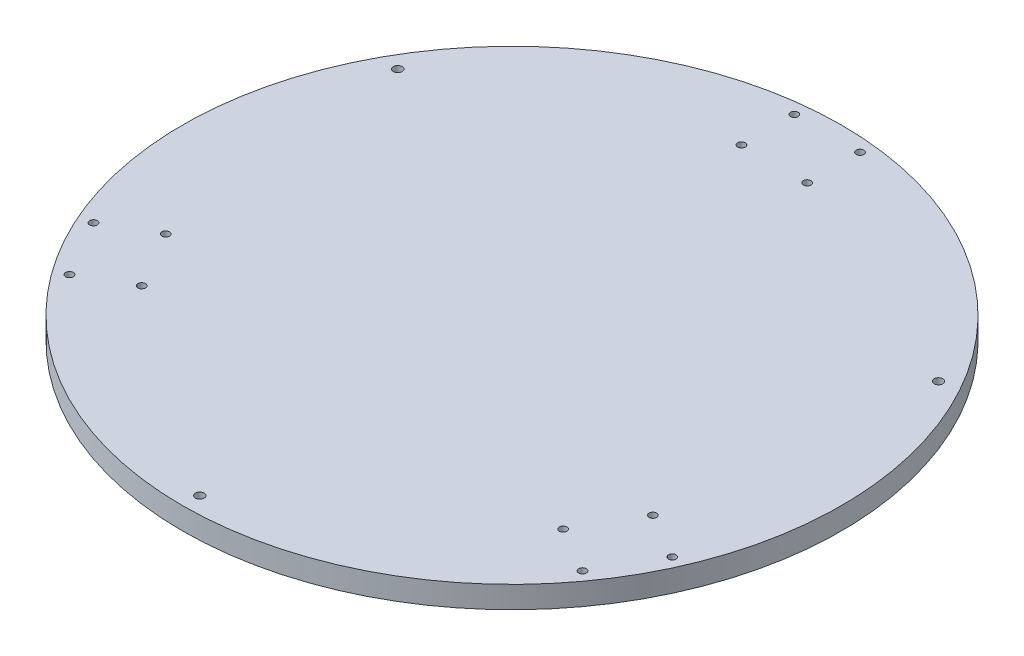
ISO-10303-21;
HEADER;
FILE_DESCRIPTION(('STEP AP214'),'2;1');
FILE_NAME('part.step','',(''),(''),'','','');
FILE_SCHEMA(('AUTOMOTIVE_DESIGN { 1 0 10303 214 1 1 1 1 }'));
ENDSEC;
DATA;
#1=APPLICATION_CONTEXT('core data for automotive mechanical design processes');
#2=APPLICATION_PROTOCOL_DEFINITION('international standard','automotive_design',2000,#1);
#3=PRODUCT_CONTEXT('',#1,'mechanical');
#4=PRODUCT('Part','Part','',(#3));
#5=PRODUCT_RELATED_PRODUCT_CATEGORY('part','',(#4));
#6=PRODUCT_DEFINITION_FORMATION('','',#4);
#7=PRODUCT_DEFINITION_CONTEXT('part definition',#1,'design');
#8=PRODUCT_DEFINITION('design','',#6,#7);
#9=PRODUCT_DEFINITION_SHAPE('','',#8);
#10=(LENGTH_UNIT() NAMED_UNIT(*) SI_UNIT(.MILLI.,.METRE.));
#11=(NAMED_UNIT(*) PLANE_ANGLE_UNIT() SI_UNIT($,.RADIAN.));
#12=(NAMED_UNIT(*) SI_UNIT($,.STERADIAN.) SOLID_ANGLE_UNIT());
#13=UNCERTAINTY_MEASURE_WITH_UNIT(LENGTH_MEASURE(1.E-05),#10,'distance_accuracy_value','');
#14=(GEOMETRIC_REPRESENTATION_CONTEXT(3) GLOBAL_UNCERTAINTY_ASSIGNED_CONTEXT((#13)) GLOBAL_UNIT_ASSIGNED_CONTEXT((#10,
#11,#12)) REPRESENTATION_CONTEXT('',''));
#15=CARTESIAN_POINT('',(0.,0.,0.));
#16=DIRECTION('',(0.,0.,1.));
#17=DIRECTION('',(1.,0.,0.));
#18=AXIS2_PLACEMENT_3D('',#15,#16,#17);
#19=CARTESIAN_POINT('',(0.,10.,0.));
#20=DIRECTION('',(0.,-1.,0.));
#21=DIRECTION('',(0.,0.,-1.));
#22=AXIS2_PLACEMENT_3D('',#19,#20,#21);
#23=CYLINDRICAL_SURFACE('',#22,150.);
#24=CARTESIAN_POINT('',(0.,10.,0.));
#25=DIRECTION('',(0.,1.,0.));
#26=DIRECTION('',(0.,0.,1.));
#27=AXIS2_PLACEMENT_3D('',#24,#25,#26);
#28=CIRCLE('',#27,150.);
#29=CARTESIAN_POINT('',(0.,10.,150.));
#30=VERTEX_POINT('',#29);
#31=EDGE_CURVE('E10',#30,#30,#28,.T.);
#32=ORIENTED_EDGE('',*,*,#31,.F.);
#33=EDGE_LOOP('',(#32));
#34=FACE_BOUND('',#33,.T.);
#35=CARTESIAN_POINT('',(0.,0.,0.));
#36=DIRECTION('',(0.,1.,0.));
#37=DIRECTION('',(0.,0.,1.));
#38=AXIS2_PLACEMENT_3D('',#35,#36,#37);
#39=CIRCLE('',#38,150.);
#40=CARTESIAN_POINT('',(0.,0.,150.));
#41=VERTEX_POINT('',#40);
#42=EDGE_CURVE('E46',#41,#41,#39,.T.);
#43=ORIENTED_EDGE('',*,*,#42,.T.);
#44=EDGE_LOOP('',(#43));
#45=FACE_BOUND('',#44,.T.);
#46=ADVANCED_FACE('F43',(#34,#45),#23,.T.);
#47=CARTESIAN_POINT('',(0.,10.,0.));
#48=DIRECTION('',(0.,1.,0.));
#49=DIRECTION('',(0.,0.,1.));
#50=AXIS2_PLACEMENT_3D('',#47,#48,#49);
#51=PLANE('',#50);
#52=CARTESIAN_POINT('',(-123.062136007708,10.,-71.0499573511008));
#53=DIRECTION('',(0.,1.,0.));
#54=DIRECTION('',(0.,0.,1.));
#55=AXIS2_PLACEMENT_3D('',#52,#53,#54);
#56=CIRCLE('',#55,2.);
#57=CARTESIAN_POINT('',(-123.062136007708,10.,-69.0499573511008));
#58=VERTEX_POINT('',#57);
#59=EDGE_CURVE('E118',#58,#58,#56,.T.);
#60=ORIENTED_EDGE('',*,*,#59,.F.);
#61=EDGE_LOOP('',(#60));
#62=FACE_BOUND('',#61,.T.);
#63=CARTESIAN_POINT('',(14.9450000000001,10.,-119.39269785433));
#64=DIRECTION('',(0.,1.,0.));
#65=DIRECTION('',(0.,0.,-1.));
#66=AXIS2_PLACEMENT_3D('',#63,#64,#65);
#67=CIRCLE('',#66,1.73);
#68=CARTESIAN_POINT('',(14.9450000000001,10.,-121.12269785433));
#69=VERTEX_POINT('',#68);
#70=EDGE_CURVE('E104',#69,#69,#67,.T.);
#71=ORIENTED_EDGE('',*,*,#70,.F.);
#72=EDGE_LOOP('',(#71));
#73=FACE_BOUND('',#72,.T.);
#74=CARTESIAN_POINT('',(14.9450000000002,10.,-143.45269785433));
#75=DIRECTION('',(0.,1.,0.));
#76=DIRECTION('',(0.,0.,-1.));
#77=AXIS2_PLACEMENT_3D('',#74,#75,#76);
#78=CIRCLE('',#77,1.73);
#79=CARTESIAN_POINT('',(14.9450000000002,10.,-145.18269785433));
#80=VERTEX_POINT('',#79);
#81=EDGE_CURVE('E103',#80,#80,#78,.T.);
#82=ORIENTED_EDGE('',*,*,#81,.F.);
#83=EDGE_LOOP('',(#82));
#84=FACE_BOUND('',#83,.T.);
#85=CARTESIAN_POINT('',(-14.945,10.,-119.39269785433));
#86=DIRECTION('',(0.,1.,0.));
#87=DIRECTION('',(0.,0.,1.));
#88=AXIS2_PLACEMENT_3D('',#85,#86,#87);
#89=CIRCLE('',#88,1.73);
#90=CARTESIAN_POINT('',(-14.945,10.,-117.66269785433));
#91=VERTEX_POINT('',#90);
#92=EDGE_CURVE('E61',#91,#91,#89,.T.);
#93=ORIENTED_EDGE('',*,*,#92,.F.);
#94=EDGE_LOOP('',(#93));
#95=FACE_BOUND('',#94,.T.);
#96=CARTESIAN_POINT('',(131.706180583272,10.,58.7835992676033));
#97=DIRECTION('',(0.,1.,0.));
#98=DIRECTION('',(0.,0.,1.));
#99=AXIS2_PLACEMENT_3D('',#96,#97,#98);
#100=CIRCLE('',#99,1.7300000000058);
#101=CARTESIAN_POINT('',(131.706180583272,10.,60.5135992676091));
#102=VERTEX_POINT('',#101);
#103=EDGE_CURVE('E94',#102,#102,#100,.T.);
#104=ORIENTED_EDGE('',*,*,#103,.F.);
#105=EDGE_LOOP('',(#104));
#106=FACE_BOUND('',#105,.T.);
#107=CARTESIAN_POINT('',(110.869609368218,10.,46.7535992676033));
#108=DIRECTION('',(0.,1.,0.));
#109=DIRECTION('',(0.,0.,1.));
#110=AXIS2_PLACEMENT_3D('',#107,#108,#109);
#111=CIRCLE('',#110,1.73000000000569);
#112=CARTESIAN_POINT('',(110.869609368218,10.,48.483599267609));
#113=VERTEX_POINT('',#112);
#114=EDGE_CURVE('E86',#113,#113,#111,.T.);
#115=ORIENTED_EDGE('',*,*,#114,.F.);
#116=EDGE_LOOP('',(#115));
#117=FACE_BOUND('',#116,.T.);
#118=CARTESIAN_POINT('',(116.761180583272,10.,84.6690985867202));
#119=DIRECTION('',(0.,1.,0.));
#120=DIRECTION('',(0.,0.,-1.));
#121=AXIS2_PLACEMENT_3D('',#118,#119,#120);
#122=CIRCLE('',#121,1.72999999999094);
#123=CARTESIAN_POINT('',(116.761180583272,10.,82.9390985867292));
#124=VERTEX_POINT('',#123);
#125=EDGE_CURVE('E78',#124,#124,#122,.T.);
#126=ORIENTED_EDGE('',*,*,#125,.F.);
#127=EDGE_LOOP('',(#126));
#128=FACE_BOUND('',#127,.T.);
#129=CARTESIAN_POINT('',(95.924609368218,10.,72.6390985867202));
#130=DIRECTION('',(0.,1.,0.));
#131=DIRECTION('',(0.,0.,-1.));
#132=AXIS2_PLACEMENT_3D('',#129,#130,#131);
#133=CIRCLE('',#132,1.72999999999108);
#134=CARTESIAN_POINT('',(95.924609368218,10.,70.9090985867291));
#135=VERTEX_POINT('',#134);
#136=EDGE_CURVE('E69',#135,#135,#133,.T.);
#137=ORIENTED_EDGE('',*,*,#136,.F.);
#138=EDGE_LOOP('',(#137));
#139=FACE_BOUND('',#138,.T.);
#140=CARTESIAN_POINT('',(-116.761180583257,10.,84.6690985867289));
#141=DIRECTION('',(0.,1.,0.));
#142=DIRECTION('',(0.,0.,1.));
#143=AXIS2_PLACEMENT_3D('',#140,#141,#142);
#144=CIRCLE('',#143,1.73000000001008);
#145=CARTESIAN_POINT('',(-116.761180583257,10.,86.399098586739));
#146=VERTEX_POINT('',#145);
#147=EDGE_CURVE('E70',#146,#146,#144,.T.);
#148=ORIENTED_EDGE('',*,*,#147,.F.);
#149=EDGE_LOOP('',(#148));
#150=FACE_BOUND('',#149,.T.);
#151=CARTESIAN_POINT('',(-95.9246093682029,10.,72.6390985867289));
#152=DIRECTION('',(0.,1.,0.));
#153=DIRECTION('',(0.,0.,1.));
#154=AXIS2_PLACEMENT_3D('',#151,#152,#153);
#155=CIRCLE('',#154,1.73000000000985);
#156=CARTESIAN_POINT('',(-95.9246093682029,10.,74.3690985867388));
#157=VERTEX_POINT('',#156);
#158=EDGE_CURVE('E165',#157,#157,#155,.T.);
#159=ORIENTED_EDGE('',*,*,#158,.F.);
#160=EDGE_LOOP('',(#159));
#161=FACE_BOUND('',#160,.T.);
#162=CARTESIAN_POINT('',(-131.706180583257,10.,58.7835992676121));
#163=DIRECTION('',(0.,1.,0.));
#164=DIRECTION('',(0.,0.,-1.));
#165=AXIS2_PLACEMENT_3D('',#162,#163,#164);
#166=CIRCLE('',#165,1.72999999999174);
#167=CARTESIAN_POINT('',(-131.706180583257,10.,57.0535992676203));
#168=VERTEX_POINT('',#167);
#169=EDGE_CURVE('E157',#168,#168,#166,.T.);
#170=ORIENTED_EDGE('',*,*,#169,.F.);
#171=EDGE_LOOP('',(#170));
#172=FACE_BOUND('',#171,.T.);
#173=CARTESIAN_POINT('',(-110.869609368203,10.,46.7535992676121));
#174=DIRECTION('',(0.,1.,0.));
#175=DIRECTION('',(0.,0.,-1.));
#176=AXIS2_PLACEMENT_3D('',#173,#174,#175);
#177=CIRCLE('',#176,1.72999999999197);
#178=CARTESIAN_POINT('',(-110.869609368203,10.,45.0235992676201));
#179=VERTEX_POINT('',#178);
#180=EDGE_CURVE('E149',#179,#179,#177,.T.);
#181=ORIENTED_EDGE('',*,*,#180,.F.);
#182=EDGE_LOOP('',(#181));
#183=FACE_BOUND('',#182,.T.);
#184=CARTESIAN_POINT('',(123.062136007708,10.,-71.0499573511111));
#185=DIRECTION('',(0.,1.,0.));
#186=DIRECTION('',(0.,0.,1.));
#187=AXIS2_PLACEMENT_3D('',#184,#185,#186);
#188=CIRCLE('',#187,2.00000000001081);
#189=CARTESIAN_POINT('',(123.062136007708,10.,-69.0499573511003));
#190=VERTEX_POINT('',#189);
#191=EDGE_CURVE('E141',#190,#190,#188,.T.);
#192=ORIENTED_EDGE('',*,*,#191,.F.);
#193=EDGE_LOOP('',(#192));
#194=FACE_BOUND('',#193,.T.);
#195=CARTESIAN_POINT('',(9.14770273707526E-12,10.,142.099914702196));
#196=DIRECTION('',(0.,1.,0.));
#197=DIRECTION('',(0.,0.,1.));
#198=AXIS2_PLACEMENT_3D('',#195,#196,#197);
#199=CIRCLE('',#198,2.00000000000428);
#200=CARTESIAN_POINT('',(9.14770273707526E-12,10.,144.099914702201));
#201=VERTEX_POINT('',#200);
#202=EDGE_CURVE('E133',#201,#201,#199,.T.);
#203=ORIENTED_EDGE('',*,*,#202,.F.);
#204=EDGE_LOOP('',(#203));
#205=FACE_BOUND('',#204,.T.);
#206=CARTESIAN_POINT('',(-14.945,10.,-143.45269785433));
#207=DIRECTION('',(0.,1.,0.));
#208=DIRECTION('',(0.,0.,1.));
#209=AXIS2_PLACEMENT_3D('',#206,#207,#208);
#210=CIRCLE('',#209,1.73);
#211=CARTESIAN_POINT('',(-14.945,10.,-141.72269785433));
#212=VERTEX_POINT('',#211);
#213=EDGE_CURVE('E57',#212,#212,#210,.T.);
#214=ORIENTED_EDGE('',*,*,#213,.F.);
#215=EDGE_LOOP('',(#214));
#216=FACE_BOUND('',#215,.T.);
#217=ORIENTED_EDGE('',*,*,#31,.T.);
#218=EDGE_LOOP('',(#217));
#219=FACE_BOUND('',#218,.T.);
#220=ADVANCED_FACE('F179',(#62,#73,#84,#95,#106,#117,#128,#139,#150,#161,#172,#183,#194,#205,
#216,#219),#51,.T.);
#221=CARTESIAN_POINT('',(0.,0.,0.));
#222=DIRECTION('',(0.,1.,0.));
#223=DIRECTION('',(0.,0.,1.));
#224=AXIS2_PLACEMENT_3D('',#221,#222,#223);
#225=PLANE('',#224);
#226=CARTESIAN_POINT('',(-123.062136007708,0.,-71.0499573511008));
#227=DIRECTION('',(0.,1.,0.));
#228=DIRECTION('',(0.,0.,1.));
#229=AXIS2_PLACEMENT_3D('',#226,#227,#228);
#230=CIRCLE('',#229,2.);
#231=CARTESIAN_POINT('',(-123.062136007708,0.,-69.0499573511008));
#232=VERTEX_POINT('',#231);
#233=EDGE_CURVE('E98',#232,#232,#230,.T.);
#234=ORIENTED_EDGE('',*,*,#233,.T.);
#235=EDGE_LOOP('',(#234));
#236=FACE_BOUND('',#235,.T.);
#237=CARTESIAN_POINT('',(14.9450000000001,0.,-119.39269785433));
#238=DIRECTION('',(0.,1.,0.));
#239=DIRECTION('',(0.,0.,-1.));
#240=AXIS2_PLACEMENT_3D('',#237,#238,#239);
#241=CIRCLE('',#240,1.73);
#242=CARTESIAN_POINT('',(14.9450000000001,0.,-121.12269785433));
#243=VERTEX_POINT('',#242);
#244=EDGE_CURVE('E122',#243,#243,#241,.T.);
#245=ORIENTED_EDGE('',*,*,#244,.T.);
#246=EDGE_LOOP('',(#245));
#247=FACE_BOUND('',#246,.T.);
#248=CARTESIAN_POINT('',(14.9450000000002,0.,-143.45269785433));
#249=DIRECTION('',(0.,1.,0.));
#250=DIRECTION('',(0.,0.,-1.));
#251=AXIS2_PLACEMENT_3D('',#248,#249,#250);
#252=CIRCLE('',#251,1.73);
#253=CARTESIAN_POINT('',(14.9450000000002,0.,-145.18269785433));
#254=VERTEX_POINT('',#253);
#255=EDGE_CURVE('E99',#254,#254,#252,.T.);
#256=ORIENTED_EDGE('',*,*,#255,.T.);
#257=EDGE_LOOP('',(#256));
#258=FACE_BOUND('',#257,.T.);
#259=CARTESIAN_POINT('',(-14.945,0.,-119.39269785433));
#260=DIRECTION('',(0.,1.,0.));
#261=DIRECTION('',(0.,0.,1.));
#262=AXIS2_PLACEMENT_3D('',#259,#260,#261);
#263=CIRCLE('',#262,1.73);
#264=CARTESIAN_POINT('',(-14.945,0.,-117.66269785433));
#265=VERTEX_POINT('',#264);
#266=EDGE_CURVE('E108',#265,#265,#263,.T.);
#267=ORIENTED_EDGE('',*,*,#266,.T.);
#268=EDGE_LOOP('',(#267));
#269=FACE_BOUND('',#268,.T.);
#270=CARTESIAN_POINT('',(131.706180583272,0.,58.7835992676033));
#271=DIRECTION('',(0.,1.,0.));
#272=DIRECTION('',(0.,0.,1.));
#273=AXIS2_PLACEMENT_3D('',#270,#271,#272);
#274=CIRCLE('',#273,1.7300000000058);
#275=CARTESIAN_POINT('',(131.706180583272,0.,60.5135992676091));
#276=VERTEX_POINT('',#275);
#277=EDGE_CURVE('E90',#276,#276,#274,.T.);
#278=ORIENTED_EDGE('',*,*,#277,.T.);
#279=EDGE_LOOP('',(#278));
#280=FACE_BOUND('',#279,.T.);
#281=CARTESIAN_POINT('',(110.869609368218,0.,46.7535992676033));
#282=DIRECTION('',(0.,1.,0.));
#283=DIRECTION('',(0.,0.,1.));
#284=AXIS2_PLACEMENT_3D('',#281,#282,#283);
#285=CIRCLE('',#284,1.73000000000569);
#286=CARTESIAN_POINT('',(110.869609368218,0.,48.483599267609));
#287=VERTEX_POINT('',#286);
#288=EDGE_CURVE('E82',#287,#287,#285,.T.);
#289=ORIENTED_EDGE('',*,*,#288,.T.);
#290=EDGE_LOOP('',(#289));
#291=FACE_BOUND('',#290,.T.);
#292=CARTESIAN_POINT('',(116.761180583272,0.,84.6690985867202));
#293=DIRECTION('',(0.,1.,0.));
#294=DIRECTION('',(0.,0.,-1.));
#295=AXIS2_PLACEMENT_3D('',#292,#293,#294);
#296=CIRCLE('',#295,1.72999999999094);
#297=CARTESIAN_POINT('',(116.761180583272,0.,82.9390985867292));
#298=VERTEX_POINT('',#297);
#299=EDGE_CURVE('E74',#298,#298,#296,.T.);
#300=ORIENTED_EDGE('',*,*,#299,.T.);
#301=EDGE_LOOP('',(#300));
#302=FACE_BOUND('',#301,.T.);
#303=CARTESIAN_POINT('',(95.924609368218,0.,72.6390985867202));
#304=DIRECTION('',(0.,1.,0.));
#305=DIRECTION('',(0.,0.,-1.));
#306=AXIS2_PLACEMENT_3D('',#303,#304,#305);
#307=CIRCLE('',#306,1.72999999999108);
#308=CARTESIAN_POINT('',(95.924609368218,0.,70.9090985867291));
#309=VERTEX_POINT('',#308);
#310=EDGE_CURVE('E65',#309,#309,#307,.T.);
#311=ORIENTED_EDGE('',*,*,#310,.T.);
#312=EDGE_LOOP('',(#311));
#313=FACE_BOUND('',#312,.T.);
#314=CARTESIAN_POINT('',(-116.761180583257,0.,84.6690985867289));
#315=DIRECTION('',(0.,1.,0.));
#316=DIRECTION('',(0.,0.,1.));
#317=AXIS2_PLACEMENT_3D('',#314,#315,#316);
#318=CIRCLE('',#317,1.73000000001008);
#319=CARTESIAN_POINT('',(-116.761180583257,0.,86.399098586739));
#320=VERTEX_POINT('',#319);
#321=EDGE_CURVE('E169',#320,#320,#318,.T.);
#322=ORIENTED_EDGE('',*,*,#321,.T.);
#323=EDGE_LOOP('',(#322));
#324=FACE_BOUND('',#323,.T.);
#325=CARTESIAN_POINT('',(-95.9246093682029,0.,72.6390985867289));
#326=DIRECTION('',(0.,1.,0.));
#327=DIRECTION('',(0.,0.,1.));
#328=AXIS2_PLACEMENT_3D('',#325,#326,#327);
#329=CIRCLE('',#328,1.73000000000985);
#330=CARTESIAN_POINT('',(-95.9246093682029,0.,74.3690985867388));
#331=VERTEX_POINT('',#330);
#332=EDGE_CURVE('E161',#331,#331,#329,.T.);
#333=ORIENTED_EDGE('',*,*,#332,.T.);
#334=EDGE_LOOP('',(#333));
#335=FACE_BOUND('',#334,.T.);
#336=CARTESIAN_POINT('',(-131.706180583257,0.,58.7835992676121));
#337=DIRECTION('',(0.,1.,0.));
#338=DIRECTION('',(0.,0.,-1.));
#339=AXIS2_PLACEMENT_3D('',#336,#337,#338);
#340=CIRCLE('',#339,1.72999999999174);
#341=CARTESIAN_POINT('',(-131.706180583257,0.,57.0535992676203));
#342=VERTEX_POINT('',#341);
#343=EDGE_CURVE('E153',#342,#342,#340,.T.);
#344=ORIENTED_EDGE('',*,*,#343,.T.);
#345=EDGE_LOOP('',(#344));
#346=FACE_BOUND('',#345,.T.);
#347=CARTESIAN_POINT('',(-110.869609368203,0.,46.7535992676121));
#348=DIRECTION('',(0.,1.,0.));
#349=DIRECTION('',(0.,0.,-1.));
#350=AXIS2_PLACEMENT_3D('',#347,#348,#349);
#351=CIRCLE('',#350,1.72999999999197);
#352=CARTESIAN_POINT('',(-110.869609368203,0.,45.0235992676201));
#353=VERTEX_POINT('',#352);
#354=EDGE_CURVE('E145',#353,#353,#351,.T.);
#355=ORIENTED_EDGE('',*,*,#354,.T.);
#356=EDGE_LOOP('',(#355));
#357=FACE_BOUND('',#356,.T.);
#358=CARTESIAN_POINT('',(123.062136007708,0.,-71.0499573511111));
#359=DIRECTION('',(0.,1.,0.));
#360=DIRECTION('',(0.,0.,1.));
#361=AXIS2_PLACEMENT_3D('',#358,#359,#360);
#362=CIRCLE('',#361,2.00000000001081);
#363=CARTESIAN_POINT('',(123.062136007708,0.,-69.0499573511003));
#364=VERTEX_POINT('',#363);
#365=EDGE_CURVE('E137',#364,#364,#362,.T.);
#366=ORIENTED_EDGE('',*,*,#365,.T.);
#367=EDGE_LOOP('',(#366));
#368=FACE_BOUND('',#367,.T.);
#369=CARTESIAN_POINT('',(9.14770273707526E-12,0.,142.099914702196));
#370=DIRECTION('',(0.,1.,0.));
#371=DIRECTION('',(0.,0.,1.));
#372=AXIS2_PLACEMENT_3D('',#369,#370,#371);
#373=CIRCLE('',#372,2.00000000000428);
#374=CARTESIAN_POINT('',(9.14770273707526E-12,0.,144.099914702201));
#375=VERTEX_POINT('',#374);
#376=EDGE_CURVE('E129',#375,#375,#373,.T.);
#377=ORIENTED_EDGE('',*,*,#376,.T.);
#378=EDGE_LOOP('',(#377));
#379=FACE_BOUND('',#378,.T.);
#380=CARTESIAN_POINT('',(-14.945,0.,-143.45269785433));
#381=DIRECTION('',(0.,1.,0.));
#382=DIRECTION('',(0.,0.,1.));
#383=AXIS2_PLACEMENT_3D('',#380,#381,#382);
#384=CIRCLE('',#383,1.73);
#385=CARTESIAN_POINT('',(-14.945,0.,-141.72269785433));
#386=VERTEX_POINT('',#385);
#387=EDGE_CURVE('E55',#386,#386,#384,.T.);
#388=ORIENTED_EDGE('',*,*,#387,.T.);
#389=EDGE_LOOP('',(#388));
#390=FACE_BOUND('',#389,.T.);
#391=ORIENTED_EDGE('',*,*,#42,.F.);
#392=EDGE_LOOP('',(#391));
#393=FACE_BOUND('',#392,.T.);
#394=ADVANCED_FACE('F182',(#236,#247,#258,#269,#280,#291,#302,#313,#324,#335,#346,#357,#368,
#379,#390,#393),#225,.F.);
#395=CARTESIAN_POINT('',(-14.945,0.,-143.45269785433));
#396=DIRECTION('',(0.,1.,0.));
#397=DIRECTION('',(0.,0.,1.));
#398=AXIS2_PLACEMENT_3D('',#395,#396,#397);
#399=CYLINDRICAL_SURFACE('',#398,1.73);
#400=ORIENTED_EDGE('',*,*,#387,.F.);
#401=EDGE_LOOP('',(#400));
#402=FACE_BOUND('',#401,.T.);
#403=ORIENTED_EDGE('',*,*,#213,.T.);
#404=EDGE_LOOP('',(#403));
#405=FACE_BOUND('',#404,.T.);
#406=ADVANCED_FACE('F197',(#402,#405),#399,.F.);
#407=CARTESIAN_POINT('',(9.14770273707526E-12,0.,142.099914702196));
#408=DIRECTION('',(0.,1.,0.));
#409=DIRECTION('',(0.,0.,1.));
#410=AXIS2_PLACEMENT_3D('',#407,#408,#409);
#411=CYLINDRICAL_SURFACE('',#410,2.00000000000428);
#412=ORIENTED_EDGE('',*,*,#376,.F.);
#413=EDGE_LOOP('',(#412));
#414=FACE_BOUND('',#413,.T.);
#415=ORIENTED_EDGE('',*,*,#202,.T.);
#416=EDGE_LOOP('',(#415));
#417=FACE_BOUND('',#416,.T.);
#418=ADVANCED_FACE('F199',(#414,#417),#411,.F.);
#419=CARTESIAN_POINT('',(123.062136007708,0.,-71.0499573511111));
#420=DIRECTION('',(0.,1.,0.));
#421=DIRECTION('',(0.,0.,1.));
#422=AXIS2_PLACEMENT_3D('',#419,#420,#421);
#423=CYLINDRICAL_SURFACE('',#422,2.00000000001081);
#424=ORIENTED_EDGE('',*,*,#365,.F.);
#425=EDGE_LOOP('',(#424));
#426=FACE_BOUND('',#425,.T.);
#427=ORIENTED_EDGE('',*,*,#191,.T.);
#428=EDGE_LOOP('',(#427));
#429=FACE_BOUND('',#428,.T.);
#430=ADVANCED_FACE('F206',(#426,#429),#423,.F.);
#431=CARTESIAN_POINT('',(-110.869609368203,0.,46.7535992676121));
#432=DIRECTION('',(0.,1.,0.));
#433=DIRECTION('',(0.,0.,1.));
#434=AXIS2_PLACEMENT_3D('',#431,#432,#433);
#435=CYLINDRICAL_SURFACE('',#434,1.72999999999197);
#436=ORIENTED_EDGE('',*,*,#354,.F.);
#437=EDGE_LOOP('',(#436));
#438=FACE_BOUND('',#437,.T.);
#439=ORIENTED_EDGE('',*,*,#180,.T.);
#440=EDGE_LOOP('',(#439));
#441=FACE_BOUND('',#440,.T.);
#442=ADVANCED_FACE('F249',(#438,#441),#435,.F.);
#443=CARTESIAN_POINT('',(-131.706180583257,0.,58.7835992676121));
#444=DIRECTION('',(0.,1.,0.));
#445=DIRECTION('',(0.,0.,1.));
#446=AXIS2_PLACEMENT_3D('',#443,#444,#445);
#447=CYLINDRICAL_SURFACE('',#446,1.72999999999174);
#448=ORIENTED_EDGE('',*,*,#343,.F.);
#449=EDGE_LOOP('',(#448));
#450=FACE_BOUND('',#449,.T.);
#451=ORIENTED_EDGE('',*,*,#169,.T.);
#452=EDGE_LOOP('',(#451));
#453=FACE_BOUND('',#452,.T.);
#454=ADVANCED_FACE('F260',(#450,#453),#447,.F.);
#455=CARTESIAN_POINT('',(-95.9246093682029,0.,72.6390985867289));
#456=DIRECTION('',(0.,1.,0.));
#457=DIRECTION('',(0.,0.,1.));
#458=AXIS2_PLACEMENT_3D('',#455,#456,#457);
#459=CYLINDRICAL_SURFACE('',#458,1.73000000000985);
#460=ORIENTED_EDGE('',*,*,#332,.F.);
#461=EDGE_LOOP('',(#460));
#462=FACE_BOUND('',#461,.T.);
#463=ORIENTED_EDGE('',*,*,#158,.T.);
#464=EDGE_LOOP('',(#463));
#465=FACE_BOUND('',#464,.T.);
#466=ADVANCED_FACE('F271',(#462,#465),#459,.F.);
#467=CARTESIAN_POINT('',(-116.761180583257,0.,84.6690985867289));
#468=DIRECTION('',(0.,1.,0.));
#469=DIRECTION('',(0.,0.,1.));
#470=AXIS2_PLACEMENT_3D('',#467,#468,#469);
#471=CYLINDRICAL_SURFACE('',#470,1.73000000001008);
#472=ORIENTED_EDGE('',*,*,#321,.F.);
#473=EDGE_LOOP('',(#472));
#474=FACE_BOUND('',#473,.T.);
#475=ORIENTED_EDGE('',*,*,#147,.T.);
#476=EDGE_LOOP('',(#475));
#477=FACE_BOUND('',#476,.T.);
#478=ADVANCED_FACE('F177',(#474,#477),#471,.F.);
#479=CARTESIAN_POINT('',(95.924609368218,0.,72.6390985867202));
#480=DIRECTION('',(0.,1.,0.));
#481=DIRECTION('',(0.,0.,1.));
#482=AXIS2_PLACEMENT_3D('',#479,#480,#481);
#483=CYLINDRICAL_SURFACE('',#482,1.72999999999108);
#484=ORIENTED_EDGE('',*,*,#310,.F.);
#485=EDGE_LOOP('',(#484));
#486=FACE_BOUND('',#485,.T.);
#487=ORIENTED_EDGE('',*,*,#136,.T.);
#488=EDGE_LOOP('',(#487));
#489=FACE_BOUND('',#488,.T.);
#490=ADVANCED_FACE('F292',(#486,#489),#483,.F.);
#491=CARTESIAN_POINT('',(116.761180583272,0.,84.6690985867202));
#492=DIRECTION('',(0.,1.,0.));
#493=DIRECTION('',(0.,0.,1.));
#494=AXIS2_PLACEMENT_3D('',#491,#492,#493);
#495=CYLINDRICAL_SURFACE('',#494,1.72999999999094);
#496=ORIENTED_EDGE('',*,*,#299,.F.);
#497=EDGE_LOOP('',(#496));
#498=FACE_BOUND('',#497,.T.);
#499=ORIENTED_EDGE('',*,*,#125,.T.);
#500=EDGE_LOOP('',(#499));
#501=FACE_BOUND('',#500,.T.);
#502=ADVANCED_FACE('F303',(#498,#501),#495,.F.);
#503=CARTESIAN_POINT('',(110.869609368218,0.,46.7535992676033));
#504=DIRECTION('',(0.,1.,0.));
#505=DIRECTION('',(0.,0.,1.));
#506=AXIS2_PLACEMENT_3D('',#503,#504,#505);
#507=CYLINDRICAL_SURFACE('',#506,1.73000000000569);
#508=ORIENTED_EDGE('',*,*,#288,.F.);
#509=EDGE_LOOP('',(#508));
#510=FACE_BOUND('',#509,.T.);
#511=ORIENTED_EDGE('',*,*,#114,.T.);
#512=EDGE_LOOP('',(#511));
#513=FACE_BOUND('',#512,.T.);
#514=ADVANCED_FACE('F313',(#510,#513),#507,.F.);
#515=CARTESIAN_POINT('',(131.706180583272,0.,58.7835992676033));
#516=DIRECTION('',(0.,1.,0.));
#517=DIRECTION('',(0.,0.,1.));
#518=AXIS2_PLACEMENT_3D('',#515,#516,#517);
#519=CYLINDRICAL_SURFACE('',#518,1.7300000000058);
#520=ORIENTED_EDGE('',*,*,#277,.F.);
#521=EDGE_LOOP('',(#520));
#522=FACE_BOUND('',#521,.T.);
#523=ORIENTED_EDGE('',*,*,#103,.T.);
#524=EDGE_LOOP('',(#523));
#525=FACE_BOUND('',#524,.T.);
#526=ADVANCED_FACE('F324',(#522,#525),#519,.F.);
#527=CARTESIAN_POINT('',(-14.945,0.,-119.39269785433));
#528=DIRECTION('',(0.,1.,0.));
#529=DIRECTION('',(0.,0.,1.));
#530=AXIS2_PLACEMENT_3D('',#527,#528,#529);
#531=CYLINDRICAL_SURFACE('',#530,1.73);
#532=ORIENTED_EDGE('',*,*,#266,.F.);
#533=EDGE_LOOP('',(#532));
#534=FACE_BOUND('',#533,.T.);
#535=ORIENTED_EDGE('',*,*,#92,.T.);
#536=EDGE_LOOP('',(#535));
#537=FACE_BOUND('',#536,.T.);
#538=ADVANCED_FACE('F335',(#534,#537),#531,.F.);
#539=CARTESIAN_POINT('',(14.9450000000002,0.,-143.45269785433));
#540=DIRECTION('',(0.,1.,0.));
#541=DIRECTION('',(0.,0.,1.));
#542=AXIS2_PLACEMENT_3D('',#539,#540,#541);
#543=CYLINDRICAL_SURFACE('',#542,1.73);
#544=ORIENTED_EDGE('',*,*,#255,.F.);
#545=EDGE_LOOP('',(#544));
#546=FACE_BOUND('',#545,.T.);
#547=ORIENTED_EDGE('',*,*,#81,.T.);
#548=EDGE_LOOP('',(#547));
#549=FACE_BOUND('',#548,.T.);
#550=ADVANCED_FACE('F346',(#546,#549),#543,.F.);
#551=CARTESIAN_POINT('',(14.9450000000001,0.,-119.39269785433));
#552=DIRECTION('',(0.,1.,0.));
#553=DIRECTION('',(0.,0.,1.));
#554=AXIS2_PLACEMENT_3D('',#551,#552,#553);
#555=CYLINDRICAL_SURFACE('',#554,1.73);
#556=ORIENTED_EDGE('',*,*,#244,.F.);
#557=EDGE_LOOP('',(#556));
#558=FACE_BOUND('',#557,.T.);
#559=ORIENTED_EDGE('',*,*,#70,.T.);
#560=EDGE_LOOP('',(#559));
#561=FACE_BOUND('',#560,.T.);
#562=ADVANCED_FACE('F357',(#558,#561),#555,.F.);
#563=CARTESIAN_POINT('',(-123.062136007708,0.,-71.0499573511008));
#564=DIRECTION('',(0.,1.,0.));
#565=DIRECTION('',(0.,0.,1.));
#566=AXIS2_PLACEMENT_3D('',#563,#564,#565);
#567=CYLINDRICAL_SURFACE('',#566,2.);
#568=ORIENTED_EDGE('',*,*,#233,.F.);
#569=EDGE_LOOP('',(#568));
#570=FACE_BOUND('',#569,.T.);
#571=ORIENTED_EDGE('',*,*,#59,.T.);
#572=EDGE_LOOP('',(#571));
#573=FACE_BOUND('',#572,.T.);
#574=ADVANCED_FACE('F368',(#570,#573),#567,.F.);
#575=CLOSED_SHELL('',(#46,#220,#394,#406,#418,#430,#442,#454,#466,#478,#490,#502,#514,#526,#538,
#550,#562,#574));
#576=MANIFOLD_SOLID_BREP('B2',#575);
#577=ADVANCED_BREP_SHAPE_REPRESENTATION('',(#18,#576),#14);
#578=SHAPE_DEFINITION_REPRESENTATION(#9,#577);
ENDSEC;
END-ISO-10303-21;
